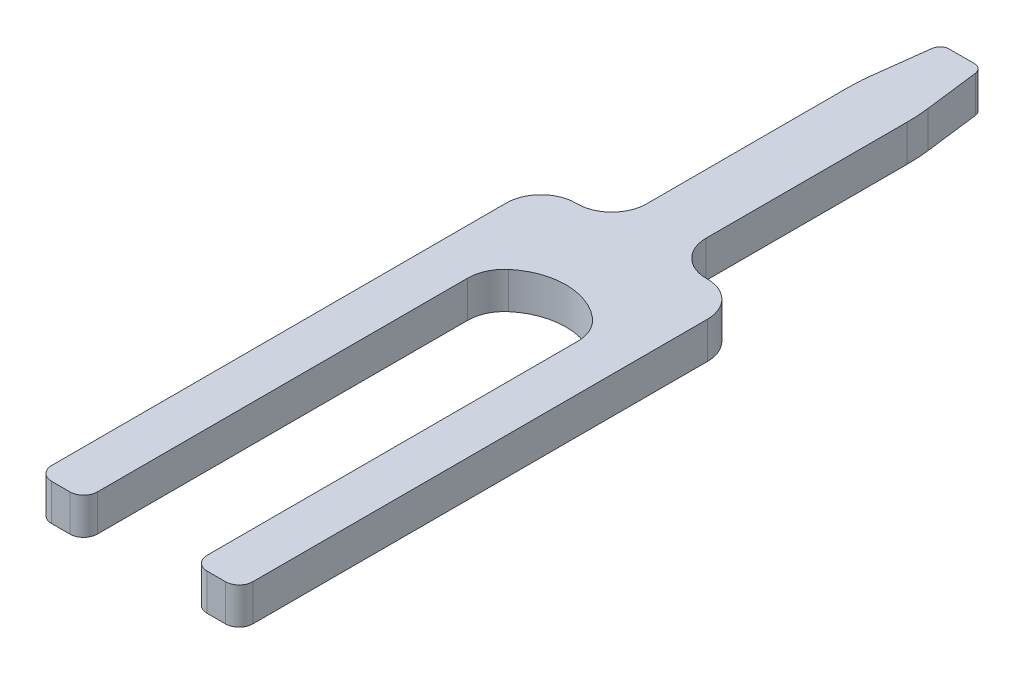
ISO-10303-21;
HEADER;
FILE_DESCRIPTION(('STEP AP214'),'2;1');
FILE_NAME('part.step','',(''),(''),'','','');
FILE_SCHEMA(('AUTOMOTIVE_DESIGN { 1 0 10303 214 1 1 1 1 }'));
ENDSEC;
DATA;
#1=APPLICATION_CONTEXT('core data for automotive mechanical design processes');
#2=APPLICATION_PROTOCOL_DEFINITION('international standard','automotive_design',2000,#1);
#3=PRODUCT_CONTEXT('',#1,'mechanical');
#4=PRODUCT('Part','Part','',(#3));
#5=PRODUCT_RELATED_PRODUCT_CATEGORY('part','',(#4));
#6=PRODUCT_DEFINITION_FORMATION('','',#4);
#7=PRODUCT_DEFINITION_CONTEXT('part definition',#1,'design');
#8=PRODUCT_DEFINITION('design','',#6,#7);
#9=PRODUCT_DEFINITION_SHAPE('','',#8);
#10=(LENGTH_UNIT() NAMED_UNIT(*) SI_UNIT(.MILLI.,.METRE.));
#11=(NAMED_UNIT(*) PLANE_ANGLE_UNIT() SI_UNIT($,.RADIAN.));
#12=(NAMED_UNIT(*) SI_UNIT($,.STERADIAN.) SOLID_ANGLE_UNIT());
#13=UNCERTAINTY_MEASURE_WITH_UNIT(LENGTH_MEASURE(1.E-05),#10,'distance_accuracy_value','');
#14=(GEOMETRIC_REPRESENTATION_CONTEXT(3) GLOBAL_UNCERTAINTY_ASSIGNED_CONTEXT((#13)) GLOBAL_UNIT_ASSIGNED_CONTEXT((#10,
#11,#12)) REPRESENTATION_CONTEXT('',''));
#15=CARTESIAN_POINT('',(0.,0.,0.));
#16=DIRECTION('',(0.,0.,1.));
#17=DIRECTION('',(1.,0.,0.));
#18=AXIS2_PLACEMENT_3D('',#15,#16,#17);
#19=CARTESIAN_POINT('',(0.720000000000001,-0.2,0.88));
#20=DIRECTION('',(0.,1.,0.));
#21=DIRECTION('',(0.,0.,1.));
#22=AXIS2_PLACEMENT_3D('',#19,#20,#21);
#23=CYLINDRICAL_SURFACE('',#22,0.38);
#24=DIRECTION('',(0.,1.,0.));
#25=VECTOR('',#24,1.);
#26=CARTESIAN_POINT('',(0.719999999999999,-0.2,0.5));
#27=LINE('',#26,#25);
#28=CARTESIAN_POINT('',(0.719999999999999,-0.2,0.5));
#29=VERTEX_POINT('',#28);
#30=CARTESIAN_POINT('',(0.719999999999999,0.2,0.5));
#31=VERTEX_POINT('',#30);
#32=EDGE_CURVE('E11',#29,#31,#27,.T.);
#33=ORIENTED_EDGE('',*,*,#32,.T.);
#34=CARTESIAN_POINT('',(0.720000000000001,0.2,0.88));
#35=DIRECTION('',(0.,1.,0.));
#36=DIRECTION('',(0.,0.,-1.));
#37=AXIS2_PLACEMENT_3D('',#34,#35,#36);
#38=CIRCLE('',#37,0.38);
#39=CARTESIAN_POINT('',(1.1,0.2,0.880000000000003));
#40=VERTEX_POINT('',#39);
#41=EDGE_CURVE('E24',#40,#31,#38,.T.);
#42=ORIENTED_EDGE('',*,*,#41,.F.);
#43=DIRECTION('',(0.,1.,0.));
#44=VECTOR('',#43,1.);
#45=CARTESIAN_POINT('',(1.1,-0.2,0.880000000000003));
#46=LINE('',#45,#44);
#47=CARTESIAN_POINT('',(1.1,-0.2,0.880000000000003));
#48=VERTEX_POINT('',#47);
#49=EDGE_CURVE('E443',#48,#40,#46,.T.);
#50=ORIENTED_EDGE('',*,*,#49,.F.);
#51=CARTESIAN_POINT('',(0.720000000000001,-0.2,0.88));
#52=DIRECTION('',(0.,1.,0.));
#53=DIRECTION('',(0.,0.,-1.));
#54=AXIS2_PLACEMENT_3D('',#51,#52,#53);
#55=CIRCLE('',#54,0.38);
#56=EDGE_CURVE('E441',#48,#29,#55,.T.);
#57=ORIENTED_EDGE('',*,*,#56,.T.);
#58=EDGE_LOOP('',(#33,#42,#50,#57));
#59=FACE_BOUND('',#58,.T.);
#60=ADVANCED_FACE('F17',(#59),#23,.T.);
#61=CARTESIAN_POINT('',(1.1,-0.2,0.880000000000003));
#62=DIRECTION('',(1.,0.,0.));
#63=DIRECTION('',(0.,0.,-1.));
#64=AXIS2_PLACEMENT_3D('',#61,#62,#63);
#65=PLANE('',#64);
#66=ORIENTED_EDGE('',*,*,#49,.T.);
#67=DIRECTION('',(0.,0.,-1.));
#68=VECTOR('',#67,1.);
#69=CARTESIAN_POINT('',(1.1,0.2,0.880000000000003));
#70=LINE('',#69,#68);
#71=CARTESIAN_POINT('',(1.1,0.2,5.85));
#72=VERTEX_POINT('',#71);
#73=EDGE_CURVE('E438',#72,#40,#70,.T.);
#74=ORIENTED_EDGE('',*,*,#73,.F.);
#75=DIRECTION('',(0.,1.,0.));
#76=VECTOR('',#75,1.);
#77=CARTESIAN_POINT('',(1.1,-0.2,5.85));
#78=LINE('',#77,#76);
#79=CARTESIAN_POINT('',(1.1,-0.2,5.85));
#80=VERTEX_POINT('',#79);
#81=EDGE_CURVE('E435',#80,#72,#78,.T.);
#82=ORIENTED_EDGE('',*,*,#81,.F.);
#83=DIRECTION('',(0.,0.,-1.));
#84=VECTOR('',#83,1.);
#85=CARTESIAN_POINT('',(1.1,-0.2,0.880000000000003));
#86=LINE('',#85,#84);
#87=EDGE_CURVE('E432',#80,#48,#86,.T.);
#88=ORIENTED_EDGE('',*,*,#87,.T.);
#89=EDGE_LOOP('',(#66,#74,#82,#88));
#90=FACE_BOUND('',#89,.T.);
#91=ADVANCED_FACE('F448',(#90),#65,.T.);
#92=CARTESIAN_POINT('',(0.950000000000002,-0.2,5.85));
#93=DIRECTION('',(0.,1.,0.));
#94=DIRECTION('',(0.,0.,1.));
#95=AXIS2_PLACEMENT_3D('',#92,#93,#94);
#96=CYLINDRICAL_SURFACE('',#95,0.15);
#97=ORIENTED_EDGE('',*,*,#81,.T.);
#98=CARTESIAN_POINT('',(0.950000000000002,0.2,5.85));
#99=DIRECTION('',(0.,1.,0.));
#100=DIRECTION('',(0.,0.,1.));
#101=AXIS2_PLACEMENT_3D('',#98,#99,#100);
#102=CIRCLE('',#101,0.15);
#103=CARTESIAN_POINT('',(0.950000000000002,0.2,6.));
#104=VERTEX_POINT('',#103);
#105=EDGE_CURVE('E429',#104,#72,#102,.T.);
#106=ORIENTED_EDGE('',*,*,#105,.F.);
#107=DIRECTION('',(0.,1.,0.));
#108=VECTOR('',#107,1.);
#109=CARTESIAN_POINT('',(0.950000000000002,-0.2,6.));
#110=LINE('',#109,#108);
#111=CARTESIAN_POINT('',(0.950000000000002,-0.2,6.));
#112=VERTEX_POINT('',#111);
#113=EDGE_CURVE('E426',#112,#104,#110,.T.);
#114=ORIENTED_EDGE('',*,*,#113,.F.);
#115=CARTESIAN_POINT('',(0.950000000000002,-0.2,5.85));
#116=DIRECTION('',(0.,1.,0.));
#117=DIRECTION('',(0.,0.,1.));
#118=AXIS2_PLACEMENT_3D('',#115,#116,#117);
#119=CIRCLE('',#118,0.15);
#120=EDGE_CURVE('E423',#112,#80,#119,.T.);
#121=ORIENTED_EDGE('',*,*,#120,.T.);
#122=EDGE_LOOP('',(#97,#106,#114,#121));
#123=FACE_BOUND('',#122,.T.);
#124=ADVANCED_FACE('F453',(#123),#96,.T.);
#125=CARTESIAN_POINT('',(0.750000000000002,-0.2,6.));
#126=DIRECTION('',(0.,0.,1.));
#127=DIRECTION('',(1.,0.,0.));
#128=AXIS2_PLACEMENT_3D('',#125,#126,#127);
#129=PLANE('',#128);
#130=ORIENTED_EDGE('',*,*,#113,.T.);
#131=DIRECTION('',(1.,0.,0.));
#132=VECTOR('',#131,1.);
#133=CARTESIAN_POINT('',(0.750000000000002,0.2,6.));
#134=LINE('',#133,#132);
#135=CARTESIAN_POINT('',(0.750000000000002,0.2,6.));
#136=VERTEX_POINT('',#135);
#137=EDGE_CURVE('E420',#136,#104,#134,.T.);
#138=ORIENTED_EDGE('',*,*,#137,.F.);
#139=DIRECTION('',(0.,1.,0.));
#140=VECTOR('',#139,1.);
#141=CARTESIAN_POINT('',(0.750000000000002,-0.2,6.));
#142=LINE('',#141,#140);
#143=CARTESIAN_POINT('',(0.750000000000002,-0.2,6.));
#144=VERTEX_POINT('',#143);
#145=EDGE_CURVE('E417',#144,#136,#142,.T.);
#146=ORIENTED_EDGE('',*,*,#145,.F.);
#147=DIRECTION('',(1.,0.,0.));
#148=VECTOR('',#147,1.);
#149=CARTESIAN_POINT('',(0.750000000000002,-0.2,6.));
#150=LINE('',#149,#148);
#151=EDGE_CURVE('E414',#144,#112,#150,.T.);
#152=ORIENTED_EDGE('',*,*,#151,.T.);
#153=EDGE_LOOP('',(#130,#138,#146,#152));
#154=FACE_BOUND('',#153,.T.);
#155=ADVANCED_FACE('F455',(#154),#129,.T.);
#156=CARTESIAN_POINT('',(0.750000000000002,-0.2,5.85));
#157=DIRECTION('',(0.,1.,0.));
#158=DIRECTION('',(0.,0.,1.));
#159=AXIS2_PLACEMENT_3D('',#156,#157,#158);
#160=CYLINDRICAL_SURFACE('',#159,0.15);
#161=ORIENTED_EDGE('',*,*,#145,.T.);
#162=CARTESIAN_POINT('',(0.750000000000002,0.2,5.85));
#163=DIRECTION('',(0.,1.,0.));
#164=DIRECTION('',(0.,0.,1.));
#165=AXIS2_PLACEMENT_3D('',#162,#163,#164);
#166=CIRCLE('',#165,0.15);
#167=CARTESIAN_POINT('',(0.600000000000002,0.2,5.85));
#168=VERTEX_POINT('',#167);
#169=EDGE_CURVE('E411',#168,#136,#166,.T.);
#170=ORIENTED_EDGE('',*,*,#169,.F.);
#171=DIRECTION('',(0.,1.,0.));
#172=VECTOR('',#171,1.);
#173=CARTESIAN_POINT('',(0.600000000000002,-0.2,5.85));
#174=LINE('',#173,#172);
#175=CARTESIAN_POINT('',(0.600000000000002,-0.2,5.85));
#176=VERTEX_POINT('',#175);
#177=EDGE_CURVE('E408',#176,#168,#174,.T.);
#178=ORIENTED_EDGE('',*,*,#177,.F.);
#179=CARTESIAN_POINT('',(0.750000000000002,-0.2,5.85));
#180=DIRECTION('',(0.,1.,0.));
#181=DIRECTION('',(0.,0.,1.));
#182=AXIS2_PLACEMENT_3D('',#179,#180,#181);
#183=CIRCLE('',#182,0.15);
#184=EDGE_CURVE('E405',#176,#144,#183,.T.);
#185=ORIENTED_EDGE('',*,*,#184,.T.);
#186=EDGE_LOOP('',(#161,#170,#178,#185));
#187=FACE_BOUND('',#186,.T.);
#188=ADVANCED_FACE('F457',(#187),#160,.T.);
#189=CARTESIAN_POINT('',(0.600000000000001,-0.2,1.8007390104135));
#190=DIRECTION('',(-1.,0.,0.));
#191=DIRECTION('',(0.,0.,1.));
#192=AXIS2_PLACEMENT_3D('',#189,#190,#191);
#193=PLANE('',#192);
#194=ORIENTED_EDGE('',*,*,#177,.T.);
#195=DIRECTION('',(0.,0.,1.));
#196=VECTOR('',#195,1.);
#197=CARTESIAN_POINT('',(0.600000000000001,0.2,1.8007390104135));
#198=LINE('',#197,#196);
#199=CARTESIAN_POINT('',(0.600000000000001,0.2,1.8007390104135));
#200=VERTEX_POINT('',#199);
#201=EDGE_CURVE('E402',#200,#168,#198,.T.);
#202=ORIENTED_EDGE('',*,*,#201,.F.);
#203=DIRECTION('',(0.,1.,0.));
#204=VECTOR('',#203,1.);
#205=CARTESIAN_POINT('',(0.600000000000001,-0.2,1.8007390104135));
#206=LINE('',#205,#204);
#207=CARTESIAN_POINT('',(0.600000000000001,-0.2,1.8007390104135));
#208=VERTEX_POINT('',#207);
#209=EDGE_CURVE('E399',#208,#200,#206,.T.);
#210=ORIENTED_EDGE('',*,*,#209,.F.);
#211=DIRECTION('',(0.,0.,1.));
#212=VECTOR('',#211,1.);
#213=CARTESIAN_POINT('',(0.600000000000001,-0.2,1.8007390104135));
#214=LINE('',#213,#212);
#215=EDGE_CURVE('E396',#208,#176,#214,.T.);
#216=ORIENTED_EDGE('',*,*,#215,.T.);
#217=EDGE_LOOP('',(#194,#202,#210,#216));
#218=FACE_BOUND('',#217,.T.);
#219=ADVANCED_FACE('F460',(#218),#193,.T.);
#220=CARTESIAN_POINT('',(0.200000000000001,-0.2,1.8007390104135));
#221=DIRECTION('',(0.,1.,0.));
#222=DIRECTION('',(0.,0.,1.));
#223=AXIS2_PLACEMENT_3D('',#220,#221,#222);
#224=CYLINDRICAL_SURFACE('',#223,0.4);
#225=ORIENTED_EDGE('',*,*,#209,.T.);
#226=CARTESIAN_POINT('',(0.200000000000001,0.2,1.8007390104135));
#227=DIRECTION('',(0.,-1.,0.));
#228=DIRECTION('',(0.,0.,-1.));
#229=AXIS2_PLACEMENT_3D('',#226,#227,#228);
#230=CIRCLE('',#229,0.4);
#231=CARTESIAN_POINT('',(0.459500566420053,0.2,1.49633885268083));
#232=VERTEX_POINT('',#231);
#233=EDGE_CURVE('E393',#232,#200,#230,.T.);
#234=ORIENTED_EDGE('',*,*,#233,.F.);
#235=DIRECTION('',(0.,1.,0.));
#236=VECTOR('',#235,1.);
#237=CARTESIAN_POINT('',(0.459500566420053,-0.2,1.49633885268083));
#238=LINE('',#237,#236);
#239=CARTESIAN_POINT('',(0.459500566420053,-0.2,1.49633885268083));
#240=VERTEX_POINT('',#239);
#241=EDGE_CURVE('E391',#240,#232,#238,.T.);
#242=ORIENTED_EDGE('',*,*,#241,.F.);
#243=CARTESIAN_POINT('',(0.200000000000001,-0.2,1.8007390104135));
#244=DIRECTION('',(0.,-1.,0.));
#245=DIRECTION('',(0.,0.,-1.));
#246=AXIS2_PLACEMENT_3D('',#243,#244,#245);
#247=CIRCLE('',#246,0.4);
#248=EDGE_CURVE('E388',#240,#208,#247,.T.);
#249=ORIENTED_EDGE('',*,*,#248,.T.);
#250=EDGE_LOOP('',(#225,#234,#242,#249));
#251=FACE_BOUND('',#250,.T.);
#252=ADVANCED_FACE('F464',(#251),#224,.F.);
#253=CARTESIAN_POINT('',(0.,-0.2,2.03534362953401));
#254=DIRECTION('',(0.,1.,0.));
#255=DIRECTION('',(0.,0.,1.));
#256=AXIS2_PLACEMENT_3D('',#253,#254,#255);
#257=CYLINDRICAL_SURFACE('',#256,0.708284490872768);
#258=ORIENTED_EDGE('',*,*,#241,.T.);
#259=CARTESIAN_POINT('',(0.,0.2,2.03534362953401));
#260=DIRECTION('',(0.,-1.,0.));
#261=DIRECTION('',(0.,0.,-1.));
#262=AXIS2_PLACEMENT_3D('',#259,#260,#261);
#263=CIRCLE('',#262,0.708284490872768);
#264=CARTESIAN_POINT('',(-0.459500566420046,0.2,1.49633885268083));
#265=VERTEX_POINT('',#264);
#266=EDGE_CURVE('E385',#265,#232,#263,.T.);
#267=ORIENTED_EDGE('',*,*,#266,.F.);
#268=DIRECTION('',(0.,1.,0.));
#269=VECTOR('',#268,1.);
#270=CARTESIAN_POINT('',(-0.459500566420046,-0.2,1.49633885268083));
#271=LINE('',#270,#269);
#272=CARTESIAN_POINT('',(-0.459500566420046,-0.2,1.49633885268083));
#273=VERTEX_POINT('',#272);
#274=EDGE_CURVE('E383',#273,#265,#271,.T.);
#275=ORIENTED_EDGE('',*,*,#274,.F.);
#276=CARTESIAN_POINT('',(0.,-0.2,2.03534362953401));
#277=DIRECTION('',(0.,-1.,0.));
#278=DIRECTION('',(0.,0.,-1.));
#279=AXIS2_PLACEMENT_3D('',#276,#277,#278);
#280=CIRCLE('',#279,0.708284490872768);
#281=EDGE_CURVE('E380',#273,#240,#280,.T.);
#282=ORIENTED_EDGE('',*,*,#281,.T.);
#283=EDGE_LOOP('',(#258,#267,#275,#282));
#284=FACE_BOUND('',#283,.T.);
#285=ADVANCED_FACE('F469',(#284),#257,.F.);
#286=CARTESIAN_POINT('',(-0.199999999999998,-0.2,1.8007390104135));
#287=DIRECTION('',(0.,1.,0.));
#288=DIRECTION('',(0.,0.,1.));
#289=AXIS2_PLACEMENT_3D('',#286,#287,#288);
#290=CYLINDRICAL_SURFACE('',#289,0.4);
#291=ORIENTED_EDGE('',*,*,#274,.T.);
#292=CARTESIAN_POINT('',(-0.199999999999998,0.2,1.8007390104135));
#293=DIRECTION('',(0.,-1.,0.));
#294=DIRECTION('',(0.,0.,-1.));
#295=AXIS2_PLACEMENT_3D('',#292,#293,#294);
#296=CIRCLE('',#295,0.4);
#297=CARTESIAN_POINT('',(-0.599999999999998,0.2,1.8007390104135));
#298=VERTEX_POINT('',#297);
#299=EDGE_CURVE('E377',#298,#265,#296,.T.);
#300=ORIENTED_EDGE('',*,*,#299,.F.);
#301=DIRECTION('',(0.,1.,0.));
#302=VECTOR('',#301,1.);
#303=CARTESIAN_POINT('',(-0.599999999999998,-0.2,1.8007390104135));
#304=LINE('',#303,#302);
#305=CARTESIAN_POINT('',(-0.599999999999998,-0.2,1.8007390104135));
#306=VERTEX_POINT('',#305);
#307=EDGE_CURVE('E375',#306,#298,#304,.T.);
#308=ORIENTED_EDGE('',*,*,#307,.F.);
#309=CARTESIAN_POINT('',(-0.199999999999998,-0.2,1.8007390104135));
#310=DIRECTION('',(0.,-1.,0.));
#311=DIRECTION('',(0.,0.,-1.));
#312=AXIS2_PLACEMENT_3D('',#309,#310,#311);
#313=CIRCLE('',#312,0.4);
#314=EDGE_CURVE('E372',#306,#273,#313,.T.);
#315=ORIENTED_EDGE('',*,*,#314,.T.);
#316=EDGE_LOOP('',(#291,#300,#308,#315));
#317=FACE_BOUND('',#316,.T.);
#318=ADVANCED_FACE('F475',(#317),#290,.F.);
#319=CARTESIAN_POINT('',(-0.599999999999998,-0.2,5.85));
#320=DIRECTION('',(1.,0.,0.));
#321=DIRECTION('',(0.,0.,-1.));
#322=AXIS2_PLACEMENT_3D('',#319,#320,#321);
#323=PLANE('',#322);
#324=ORIENTED_EDGE('',*,*,#307,.T.);
#325=DIRECTION('',(0.,0.,-1.));
#326=VECTOR('',#325,1.);
#327=CARTESIAN_POINT('',(-0.599999999999998,0.2,5.85));
#328=LINE('',#327,#326);
#329=CARTESIAN_POINT('',(-0.599999999999998,0.2,5.85));
#330=VERTEX_POINT('',#329);
#331=EDGE_CURVE('E369',#330,#298,#328,.T.);
#332=ORIENTED_EDGE('',*,*,#331,.F.);
#333=DIRECTION('',(0.,1.,0.));
#334=VECTOR('',#333,1.);
#335=CARTESIAN_POINT('',(-0.599999999999998,-0.2,5.85));
#336=LINE('',#335,#334);
#337=CARTESIAN_POINT('',(-0.599999999999998,-0.2,5.85));
#338=VERTEX_POINT('',#337);
#339=EDGE_CURVE('E366',#338,#330,#336,.T.);
#340=ORIENTED_EDGE('',*,*,#339,.F.);
#341=DIRECTION('',(0.,0.,-1.));
#342=VECTOR('',#341,1.);
#343=CARTESIAN_POINT('',(-0.599999999999998,-0.2,5.85));
#344=LINE('',#343,#342);
#345=EDGE_CURVE('E363',#338,#306,#344,.T.);
#346=ORIENTED_EDGE('',*,*,#345,.T.);
#347=EDGE_LOOP('',(#324,#332,#340,#346));
#348=FACE_BOUND('',#347,.T.);
#349=ADVANCED_FACE('F477',(#348),#323,.T.);
#350=CARTESIAN_POINT('',(-0.749999999999998,-0.2,5.85));
#351=DIRECTION('',(0.,1.,0.));
#352=DIRECTION('',(0.,0.,1.));
#353=AXIS2_PLACEMENT_3D('',#350,#351,#352);
#354=CYLINDRICAL_SURFACE('',#353,0.15);
#355=ORIENTED_EDGE('',*,*,#339,.T.);
#356=CARTESIAN_POINT('',(-0.749999999999998,0.2,5.85));
#357=DIRECTION('',(0.,1.,0.));
#358=DIRECTION('',(0.,0.,-1.));
#359=AXIS2_PLACEMENT_3D('',#356,#357,#358);
#360=CIRCLE('',#359,0.15);
#361=CARTESIAN_POINT('',(-0.749999999999998,0.2,6.));
#362=VERTEX_POINT('',#361);
#363=EDGE_CURVE('E360',#362,#330,#360,.T.);
#364=ORIENTED_EDGE('',*,*,#363,.F.);
#365=DIRECTION('',(0.,1.,0.));
#366=VECTOR('',#365,1.);
#367=CARTESIAN_POINT('',(-0.749999999999998,-0.2,6.));
#368=LINE('',#367,#366);
#369=CARTESIAN_POINT('',(-0.749999999999998,-0.2,6.));
#370=VERTEX_POINT('',#369);
#371=EDGE_CURVE('E357',#370,#362,#368,.T.);
#372=ORIENTED_EDGE('',*,*,#371,.F.);
#373=CARTESIAN_POINT('',(-0.749999999999998,-0.2,5.85));
#374=DIRECTION('',(0.,1.,0.));
#375=DIRECTION('',(0.,0.,-1.));
#376=AXIS2_PLACEMENT_3D('',#373,#374,#375);
#377=CIRCLE('',#376,0.15);
#378=EDGE_CURVE('E354',#370,#338,#377,.T.);
#379=ORIENTED_EDGE('',*,*,#378,.T.);
#380=EDGE_LOOP('',(#355,#364,#372,#379));
#381=FACE_BOUND('',#380,.T.);
#382=ADVANCED_FACE('F479',(#381),#354,.T.);
#383=CARTESIAN_POINT('',(-0.949999999999998,-0.2,6.));
#384=DIRECTION('',(0.,0.,1.));
#385=DIRECTION('',(1.,0.,0.));
#386=AXIS2_PLACEMENT_3D('',#383,#384,#385);
#387=PLANE('',#386);
#388=ORIENTED_EDGE('',*,*,#371,.T.);
#389=DIRECTION('',(1.,0.,0.));
#390=VECTOR('',#389,1.);
#391=CARTESIAN_POINT('',(-0.949999999999998,0.2,6.));
#392=LINE('',#391,#390);
#393=CARTESIAN_POINT('',(-0.949999999999998,0.2,6.));
#394=VERTEX_POINT('',#393);
#395=EDGE_CURVE('E351',#394,#362,#392,.T.);
#396=ORIENTED_EDGE('',*,*,#395,.F.);
#397=DIRECTION('',(0.,1.,0.));
#398=VECTOR('',#397,1.);
#399=CARTESIAN_POINT('',(-0.949999999999998,-0.2,6.));
#400=LINE('',#399,#398);
#401=CARTESIAN_POINT('',(-0.949999999999998,-0.2,6.));
#402=VERTEX_POINT('',#401);
#403=EDGE_CURVE('E348',#402,#394,#400,.T.);
#404=ORIENTED_EDGE('',*,*,#403,.F.);
#405=DIRECTION('',(1.,0.,0.));
#406=VECTOR('',#405,1.);
#407=CARTESIAN_POINT('',(-0.949999999999998,-0.2,6.));
#408=LINE('',#407,#406);
#409=EDGE_CURVE('E345',#402,#370,#408,.T.);
#410=ORIENTED_EDGE('',*,*,#409,.T.);
#411=EDGE_LOOP('',(#388,#396,#404,#410));
#412=FACE_BOUND('',#411,.T.);
#413=ADVANCED_FACE('F481',(#412),#387,.T.);
#414=CARTESIAN_POINT('',(-0.949999999999998,-0.2,5.85));
#415=DIRECTION('',(0.,1.,0.));
#416=DIRECTION('',(0.,0.,1.));
#417=AXIS2_PLACEMENT_3D('',#414,#415,#416);
#418=CYLINDRICAL_SURFACE('',#417,0.15);
#419=ORIENTED_EDGE('',*,*,#403,.T.);
#420=CARTESIAN_POINT('',(-0.949999999999998,0.2,5.85));
#421=DIRECTION('',(0.,1.,0.));
#422=DIRECTION('',(0.,0.,1.));
#423=AXIS2_PLACEMENT_3D('',#420,#421,#422);
#424=CIRCLE('',#423,0.15);
#425=CARTESIAN_POINT('',(-1.1,0.2,5.85));
#426=VERTEX_POINT('',#425);
#427=EDGE_CURVE('E342',#426,#394,#424,.T.);
#428=ORIENTED_EDGE('',*,*,#427,.F.);
#429=DIRECTION('',(0.,1.,0.));
#430=VECTOR('',#429,1.);
#431=CARTESIAN_POINT('',(-1.1,-0.2,5.85));
#432=LINE('',#431,#430);
#433=CARTESIAN_POINT('',(-1.1,-0.2,5.85));
#434=VERTEX_POINT('',#433);
#435=EDGE_CURVE('E339',#434,#426,#432,.T.);
#436=ORIENTED_EDGE('',*,*,#435,.F.);
#437=CARTESIAN_POINT('',(-0.949999999999998,-0.2,5.85));
#438=DIRECTION('',(0.,1.,0.));
#439=DIRECTION('',(0.,0.,1.));
#440=AXIS2_PLACEMENT_3D('',#437,#438,#439);
#441=CIRCLE('',#440,0.15);
#442=EDGE_CURVE('E336',#434,#402,#441,.T.);
#443=ORIENTED_EDGE('',*,*,#442,.T.);
#444=EDGE_LOOP('',(#419,#428,#436,#443));
#445=FACE_BOUND('',#444,.T.);
#446=ADVANCED_FACE('F484',(#445),#418,.T.);
#447=CARTESIAN_POINT('',(-1.1,-0.2,0.880000000000003));
#448=DIRECTION('',(-1.,0.,0.));
#449=DIRECTION('',(0.,0.,1.));
#450=AXIS2_PLACEMENT_3D('',#447,#448,#449);
#451=PLANE('',#450);
#452=ORIENTED_EDGE('',*,*,#435,.T.);
#453=DIRECTION('',(0.,0.,1.));
#454=VECTOR('',#453,1.);
#455=CARTESIAN_POINT('',(-1.1,0.2,0.880000000000003));
#456=LINE('',#455,#454);
#457=CARTESIAN_POINT('',(-1.1,0.2,0.880000000000003));
#458=VERTEX_POINT('',#457);
#459=EDGE_CURVE('E333',#458,#426,#456,.T.);
#460=ORIENTED_EDGE('',*,*,#459,.F.);
#461=DIRECTION('',(0.,1.,0.));
#462=VECTOR('',#461,1.);
#463=CARTESIAN_POINT('',(-1.1,-0.2,0.880000000000003));
#464=LINE('',#463,#462);
#465=CARTESIAN_POINT('',(-1.1,-0.2,0.880000000000003));
#466=VERTEX_POINT('',#465);
#467=EDGE_CURVE('E330',#466,#458,#464,.T.);
#468=ORIENTED_EDGE('',*,*,#467,.F.);
#469=DIRECTION('',(0.,0.,1.));
#470=VECTOR('',#469,1.);
#471=CARTESIAN_POINT('',(-1.1,-0.2,0.880000000000003));
#472=LINE('',#471,#470);
#473=EDGE_CURVE('E327',#466,#434,#472,.T.);
#474=ORIENTED_EDGE('',*,*,#473,.T.);
#475=EDGE_LOOP('',(#452,#460,#468,#474));
#476=FACE_BOUND('',#475,.T.);
#477=ADVANCED_FACE('F489',(#476),#451,.T.);
#478=CARTESIAN_POINT('',(-0.719999999999999,-0.2,0.88));
#479=DIRECTION('',(0.,1.,0.));
#480=DIRECTION('',(0.,0.,1.));
#481=AXIS2_PLACEMENT_3D('',#478,#479,#480);
#482=CYLINDRICAL_SURFACE('',#481,0.38);
#483=ORIENTED_EDGE('',*,*,#467,.T.);
#484=CARTESIAN_POINT('',(-0.719999999999999,0.2,0.88));
#485=DIRECTION('',(0.,1.,0.));
#486=DIRECTION('',(0.,0.,1.));
#487=AXIS2_PLACEMENT_3D('',#484,#485,#486);
#488=CIRCLE('',#487,0.38);
#489=CARTESIAN_POINT('',(-0.719999999999996,0.2,0.5));
#490=VERTEX_POINT('',#489);
#491=EDGE_CURVE('E324',#490,#458,#488,.T.);
#492=ORIENTED_EDGE('',*,*,#491,.F.);
#493=DIRECTION('',(0.,1.,0.));
#494=VECTOR('',#493,1.);
#495=CARTESIAN_POINT('',(-0.719999999999996,-0.2,0.5));
#496=LINE('',#495,#494);
#497=CARTESIAN_POINT('',(-0.719999999999996,-0.2,0.5));
#498=VERTEX_POINT('',#497);
#499=EDGE_CURVE('E321',#498,#490,#496,.T.);
#500=ORIENTED_EDGE('',*,*,#499,.F.);
#501=CARTESIAN_POINT('',(-0.719999999999999,-0.2,0.88));
#502=DIRECTION('',(0.,1.,0.));
#503=DIRECTION('',(0.,0.,1.));
#504=AXIS2_PLACEMENT_3D('',#501,#502,#503);
#505=CIRCLE('',#504,0.38);
#506=EDGE_CURVE('E318',#498,#466,#505,.T.);
#507=ORIENTED_EDGE('',*,*,#506,.T.);
#508=EDGE_LOOP('',(#483,#492,#500,#507));
#509=FACE_BOUND('',#508,.T.);
#510=ADVANCED_FACE('F491',(#509),#482,.T.);
#511=CARTESIAN_POINT('',(-0.719999999999996,-0.2,0.5));
#512=DIRECTION('',(0.,0.,-1.));
#513=DIRECTION('',(-1.,0.,0.));
#514=AXIS2_PLACEMENT_3D('',#511,#512,#513);
#515=PLANE('',#514);
#516=ORIENTED_EDGE('',*,*,#499,.T.);
#517=DIRECTION('',(-1.,0.,0.));
#518=VECTOR('',#517,1.);
#519=CARTESIAN_POINT('',(-0.719999999999996,0.2,0.5));
#520=LINE('',#519,#518);
#521=CARTESIAN_POINT('',(-0.705000000000004,0.2,0.5));
#522=VERTEX_POINT('',#521);
#523=EDGE_CURVE('E315',#522,#490,#520,.T.);
#524=ORIENTED_EDGE('',*,*,#523,.F.);
#525=DIRECTION('',(0.,1.,0.));
#526=VECTOR('',#525,1.);
#527=CARTESIAN_POINT('',(-0.705000000000004,-0.2,0.5));
#528=LINE('',#527,#526);
#529=CARTESIAN_POINT('',(-0.705000000000004,-0.2,0.5));
#530=VERTEX_POINT('',#529);
#531=EDGE_CURVE('E312',#530,#522,#528,.T.);
#532=ORIENTED_EDGE('',*,*,#531,.F.);
#533=DIRECTION('',(-1.,0.,0.));
#534=VECTOR('',#533,1.);
#535=CARTESIAN_POINT('',(-0.719999999999996,-0.2,0.5));
#536=LINE('',#535,#534);
#537=EDGE_CURVE('E309',#530,#498,#536,.T.);
#538=ORIENTED_EDGE('',*,*,#537,.T.);
#539=EDGE_LOOP('',(#516,#524,#532,#538));
#540=FACE_BOUND('',#539,.T.);
#541=ADVANCED_FACE('F494',(#540),#515,.T.);
#542=CARTESIAN_POINT('',(-0.705000000000002,-0.2,0.12));
#543=DIRECTION('',(0.,1.,0.));
#544=DIRECTION('',(0.,0.,1.));
#545=AXIS2_PLACEMENT_3D('',#542,#543,#544);
#546=CYLINDRICAL_SURFACE('',#545,0.38);
#547=ORIENTED_EDGE('',*,*,#531,.T.);
#548=CARTESIAN_POINT('',(-0.705000000000002,0.2,0.12));
#549=DIRECTION('',(0.,-1.,0.));
#550=DIRECTION('',(0.,0.,1.));
#551=AXIS2_PLACEMENT_3D('',#548,#549,#550);
#552=CIRCLE('',#551,0.38);
#553=CARTESIAN_POINT('',(-0.325000000000002,0.2,0.119999999999997));
#554=VERTEX_POINT('',#553);
#555=EDGE_CURVE('E306',#554,#522,#552,.T.);
#556=ORIENTED_EDGE('',*,*,#555,.F.);
#557=DIRECTION('',(0.,1.,0.));
#558=VECTOR('',#557,1.);
#559=CARTESIAN_POINT('',(-0.325000000000002,-0.2,0.119999999999997));
#560=LINE('',#559,#558);
#561=CARTESIAN_POINT('',(-0.325000000000002,-0.2,0.119999999999997));
#562=VERTEX_POINT('',#561);
#563=EDGE_CURVE('E304',#562,#554,#560,.T.);
#564=ORIENTED_EDGE('',*,*,#563,.F.);
#565=CARTESIAN_POINT('',(-0.705000000000002,-0.2,0.12));
#566=DIRECTION('',(0.,-1.,0.));
#567=DIRECTION('',(0.,0.,1.));
#568=AXIS2_PLACEMENT_3D('',#565,#566,#567);
#569=CIRCLE('',#568,0.38);
#570=EDGE_CURVE('E301',#562,#530,#569,.T.);
#571=ORIENTED_EDGE('',*,*,#570,.T.);
#572=EDGE_LOOP('',(#547,#556,#564,#571));
#573=FACE_BOUND('',#572,.T.);
#574=ADVANCED_FACE('F497',(#573),#546,.F.);
#575=CARTESIAN_POINT('',(-0.325000000000002,-0.2,0.119999999999997));
#576=DIRECTION('',(-1.,0.,0.));
#577=DIRECTION('',(0.,0.,1.));
#578=AXIS2_PLACEMENT_3D('',#575,#576,#577);
#579=PLANE('',#578);
#580=ORIENTED_EDGE('',*,*,#563,.T.);
#581=DIRECTION('',(0.,0.,1.));
#582=VECTOR('',#581,1.);
#583=CARTESIAN_POINT('',(-0.325000000000002,0.2,0.119999999999997));
#584=LINE('',#583,#582);
#585=CARTESIAN_POINT('',(-0.325,0.2,-2.07548450340289));
#586=VERTEX_POINT('',#585);
#587=EDGE_CURVE('E298',#586,#554,#584,.T.);
#588=ORIENTED_EDGE('',*,*,#587,.F.);
#589=DIRECTION('',(0.,1.,0.));
#590=VECTOR('',#589,1.);
#591=CARTESIAN_POINT('',(-0.325,-0.2,-2.07548450340289));
#592=LINE('',#591,#590);
#593=CARTESIAN_POINT('',(-0.325,-0.2,-2.07548450340289));
#594=VERTEX_POINT('',#593);
#595=EDGE_CURVE('E295',#594,#586,#592,.T.);
#596=ORIENTED_EDGE('',*,*,#595,.F.);
#597=DIRECTION('',(0.,0.,1.));
#598=VECTOR('',#597,1.);
#599=CARTESIAN_POINT('',(-0.325000000000002,-0.2,0.119999999999997));
#600=LINE('',#599,#598);
#601=EDGE_CURVE('E292',#594,#562,#600,.T.);
#602=ORIENTED_EDGE('',*,*,#601,.T.);
#603=EDGE_LOOP('',(#580,#588,#596,#602));
#604=FACE_BOUND('',#603,.T.);
#605=ADVANCED_FACE('F569',(#604),#579,.T.);
#606=CARTESIAN_POINT('',(1.675,-0.2,-2.0754845034029));
#607=DIRECTION('',(0.,1.,0.));
#608=DIRECTION('',(0.,0.,1.));
#609=AXIS2_PLACEMENT_3D('',#606,#607,#608);
#610=CYLINDRICAL_SURFACE('',#609,2.);
#611=ORIENTED_EDGE('',*,*,#595,.T.);
#612=CARTESIAN_POINT('',(1.675,0.2,-2.0754845034029));
#613=DIRECTION('',(0.,1.,0.));
#614=DIRECTION('',(0.,0.,1.));
#615=AXIS2_PLACEMENT_3D('',#612,#613,#614);
#616=CIRCLE('',#615,2.);
#617=CARTESIAN_POINT('',(-0.309555753427334,0.2,-2.32355397258132));
#618=VERTEX_POINT('',#617);
#619=EDGE_CURVE('E289',#618,#586,#616,.T.);
#620=ORIENTED_EDGE('',*,*,#619,.F.);
#621=DIRECTION('',(0.,1.,0.));
#622=VECTOR('',#621,1.);
#623=CARTESIAN_POINT('',(-0.309555753427334,-0.2,-2.32355397258132));
#624=LINE('',#623,#622);
#625=CARTESIAN_POINT('',(-0.309555753427334,-0.2,-2.32355397258132));
#626=VERTEX_POINT('',#625);
#627=EDGE_CURVE('E286',#626,#618,#624,.T.);
#628=ORIENTED_EDGE('',*,*,#627,.F.);
#629=CARTESIAN_POINT('',(1.675,-0.2,-2.0754845034029));
#630=DIRECTION('',(0.,1.,0.));
#631=DIRECTION('',(0.,0.,1.));
#632=AXIS2_PLACEMENT_3D('',#629,#630,#631);
#633=CIRCLE('',#632,2.);
#634=EDGE_CURVE('E283',#626,#594,#633,.T.);
#635=ORIENTED_EDGE('',*,*,#634,.T.);
#636=EDGE_LOOP('',(#611,#620,#628,#635));
#637=FACE_BOUND('',#636,.T.);
#638=ADVANCED_FACE('F504',(#637),#610,.T.);
#639=CARTESIAN_POINT('',(-0.309555753427334,-0.2,-2.32355397258132));
#640=DIRECTION('',(-0.992277876713668,0.,-0.124034734589208));
#641=DIRECTION('',(-0.124034734589208,0.,0.992277876713668));
#642=AXIS2_PLACEMENT_3D('',#639,#640,#641);
#643=PLANE('',#642);
#644=ORIENTED_EDGE('',*,*,#627,.T.);
#645=DIRECTION('',(-0.124034734589208,0.,0.992277876713668));
#646=VECTOR('',#645,1.);
#647=CARTESIAN_POINT('',(-0.309555753427334,0.2,-2.32355397258132));
#648=LINE('',#647,#646);
#649=CARTESIAN_POINT('',(-0.235949565817635,0.2,-2.91240347345892));
#650=VERTEX_POINT('',#649);
#651=EDGE_CURVE('E280',#650,#618,#648,.T.);
#652=ORIENTED_EDGE('',*,*,#651,.F.);
#653=DIRECTION('',(0.,1.,0.));
#654=VECTOR('',#653,1.);
#655=CARTESIAN_POINT('',(-0.235949565817635,-0.2,-2.91240347345892));
#656=LINE('',#655,#654);
#657=CARTESIAN_POINT('',(-0.235949565817635,-0.2,-2.91240347345892));
#658=VERTEX_POINT('',#657);
#659=EDGE_CURVE('E277',#658,#650,#656,.T.);
#660=ORIENTED_EDGE('',*,*,#659,.F.);
#661=DIRECTION('',(-0.124034734589208,0.,0.992277876713668));
#662=VECTOR('',#661,1.);
#663=CARTESIAN_POINT('',(-0.309555753427334,-0.2,-2.32355397258132));
#664=LINE('',#663,#662);
#665=EDGE_CURVE('E274',#658,#626,#664,.T.);
#666=ORIENTED_EDGE('',*,*,#665,.T.);
#667=EDGE_LOOP('',(#644,#652,#660,#666));
#668=FACE_BOUND('',#667,.T.);
#669=ADVANCED_FACE('F506',(#668),#643,.T.);
#670=CARTESIAN_POINT('',(-0.13672177814627,-0.2,-2.9));
#671=DIRECTION('',(0.,1.,0.));
#672=DIRECTION('',(0.,0.,1.));
#673=AXIS2_PLACEMENT_3D('',#670,#671,#672);
#674=CYLINDRICAL_SURFACE('',#673,0.099999999999999);
#675=ORIENTED_EDGE('',*,*,#659,.T.);
#676=CARTESIAN_POINT('',(-0.13672177814627,0.2,-2.9));
#677=DIRECTION('',(0.,1.,0.));
#678=DIRECTION('',(0.,0.,-1.));
#679=AXIS2_PLACEMENT_3D('',#676,#677,#678);
#680=CIRCLE('',#679,0.099999999999999);
#681=CARTESIAN_POINT('',(-0.136721778146268,0.2,-3.));
#682=VERTEX_POINT('',#681);
#683=EDGE_CURVE('E271',#682,#650,#680,.T.);
#684=ORIENTED_EDGE('',*,*,#683,.F.);
#685=DIRECTION('',(0.,1.,0.));
#686=VECTOR('',#685,1.);
#687=CARTESIAN_POINT('',(-0.136721778146268,-0.2,-3.));
#688=LINE('',#687,#686);
#689=CARTESIAN_POINT('',(-0.136721778146268,-0.2,-3.));
#690=VERTEX_POINT('',#689);
#691=EDGE_CURVE('E268',#690,#682,#688,.T.);
#692=ORIENTED_EDGE('',*,*,#691,.F.);
#693=CARTESIAN_POINT('',(-0.13672177814627,-0.2,-2.9));
#694=DIRECTION('',(0.,1.,0.));
#695=DIRECTION('',(0.,0.,-1.));
#696=AXIS2_PLACEMENT_3D('',#693,#694,#695);
#697=CIRCLE('',#696,0.099999999999999);
#698=EDGE_CURVE('E265',#690,#658,#697,.T.);
#699=ORIENTED_EDGE('',*,*,#698,.T.);
#700=EDGE_LOOP('',(#675,#684,#692,#699));
#701=FACE_BOUND('',#700,.T.);
#702=ADVANCED_FACE('F508',(#701),#674,.T.);
#703=CARTESIAN_POINT('',(-0.136721778146268,-0.2,-3.));
#704=DIRECTION('',(0.,0.,-1.));
#705=DIRECTION('',(-1.,0.,0.));
#706=AXIS2_PLACEMENT_3D('',#703,#704,#705);
#707=PLANE('',#706);
#708=ORIENTED_EDGE('',*,*,#691,.T.);
#709=DIRECTION('',(-1.,0.,0.));
#710=VECTOR('',#709,1.);
#711=CARTESIAN_POINT('',(-0.136721778146268,0.2,-3.));
#712=LINE('',#711,#710);
#713=CARTESIAN_POINT('',(0.136721778146268,0.2,-3.));
#714=VERTEX_POINT('',#713);
#715=EDGE_CURVE('E262',#714,#682,#712,.T.);
#716=ORIENTED_EDGE('',*,*,#715,.F.);
#717=DIRECTION('',(0.,1.,0.));
#718=VECTOR('',#717,1.);
#719=CARTESIAN_POINT('',(0.136721778146268,-0.2,-3.));
#720=LINE('',#719,#718);
#721=CARTESIAN_POINT('',(0.136721778146268,-0.2,-3.));
#722=VERTEX_POINT('',#721);
#723=EDGE_CURVE('E259',#722,#714,#720,.T.);
#724=ORIENTED_EDGE('',*,*,#723,.F.);
#725=DIRECTION('',(-1.,0.,0.));
#726=VECTOR('',#725,1.);
#727=CARTESIAN_POINT('',(-0.136721778146268,-0.2,-3.));
#728=LINE('',#727,#726);
#729=EDGE_CURVE('E256',#722,#690,#728,.T.);
#730=ORIENTED_EDGE('',*,*,#729,.T.);
#731=EDGE_LOOP('',(#708,#716,#724,#730));
#732=FACE_BOUND('',#731,.T.);
#733=ADVANCED_FACE('F511',(#732),#707,.T.);
#734=CARTESIAN_POINT('',(0.136721778146267,-0.2,-2.9));
#735=DIRECTION('',(0.,1.,0.));
#736=DIRECTION('',(0.,0.,1.));
#737=AXIS2_PLACEMENT_3D('',#734,#735,#736);
#738=CYLINDRICAL_SURFACE('',#737,0.100000000000001);
#739=ORIENTED_EDGE('',*,*,#723,.T.);
#740=CARTESIAN_POINT('',(0.136721778146267,0.2,-2.9));
#741=DIRECTION('',(0.,1.,0.));
#742=DIRECTION('',(0.,0.,1.));
#743=AXIS2_PLACEMENT_3D('',#740,#741,#742);
#744=CIRCLE('',#743,0.100000000000001);
#745=CARTESIAN_POINT('',(0.235949565817635,0.2,-2.91240347345892));
#746=VERTEX_POINT('',#745);
#747=EDGE_CURVE('E253',#746,#714,#744,.T.);
#748=ORIENTED_EDGE('',*,*,#747,.F.);
#749=DIRECTION('',(0.,1.,0.));
#750=VECTOR('',#749,1.);
#751=CARTESIAN_POINT('',(0.235949565817635,-0.2,-2.91240347345892));
#752=LINE('',#751,#750);
#753=CARTESIAN_POINT('',(0.235949565817635,-0.2,-2.91240347345892));
#754=VERTEX_POINT('',#753);
#755=EDGE_CURVE('E250',#754,#746,#752,.T.);
#756=ORIENTED_EDGE('',*,*,#755,.F.);
#757=CARTESIAN_POINT('',(0.136721778146267,-0.2,-2.9));
#758=DIRECTION('',(0.,1.,0.));
#759=DIRECTION('',(0.,0.,1.));
#760=AXIS2_PLACEMENT_3D('',#757,#758,#759);
#761=CIRCLE('',#760,0.100000000000001);
#762=EDGE_CURVE('E247',#754,#722,#761,.T.);
#763=ORIENTED_EDGE('',*,*,#762,.T.);
#764=EDGE_LOOP('',(#739,#748,#756,#763));
#765=FACE_BOUND('',#764,.T.);
#766=ADVANCED_FACE('F516',(#765),#738,.T.);
#767=CARTESIAN_POINT('',(0.235949565817635,-0.2,-2.91240347345892));
#768=DIRECTION('',(0.992277876713668,0.,-0.124034734589208));
#769=DIRECTION('',(-0.124034734589208,0.,-0.992277876713668));
#770=AXIS2_PLACEMENT_3D('',#767,#768,#769);
#771=PLANE('',#770);
#772=ORIENTED_EDGE('',*,*,#755,.T.);
#773=DIRECTION('',(-0.124034734589208,0.,-0.992277876713668));
#774=VECTOR('',#773,1.);
#775=CARTESIAN_POINT('',(0.235949565817635,0.2,-2.91240347345892));
#776=LINE('',#775,#774);
#777=CARTESIAN_POINT('',(0.309555753427335,0.2,-2.32355397258132));
#778=VERTEX_POINT('',#777);
#779=EDGE_CURVE('E244',#778,#746,#776,.T.);
#780=ORIENTED_EDGE('',*,*,#779,.F.);
#781=DIRECTION('',(0.,1.,0.));
#782=VECTOR('',#781,1.);
#783=CARTESIAN_POINT('',(0.309555753427335,-0.2,-2.32355397258132));
#784=LINE('',#783,#782);
#785=CARTESIAN_POINT('',(0.309555753427335,-0.2,-2.32355397258132));
#786=VERTEX_POINT('',#785);
#787=EDGE_CURVE('E241',#786,#778,#784,.T.);
#788=ORIENTED_EDGE('',*,*,#787,.F.);
#789=DIRECTION('',(-0.124034734589208,0.,-0.992277876713668));
#790=VECTOR('',#789,1.);
#791=CARTESIAN_POINT('',(0.235949565817635,-0.2,-2.91240347345892));
#792=LINE('',#791,#790);
#793=EDGE_CURVE('E238',#786,#754,#792,.T.);
#794=ORIENTED_EDGE('',*,*,#793,.T.);
#795=EDGE_LOOP('',(#772,#780,#788,#794));
#796=FACE_BOUND('',#795,.T.);
#797=ADVANCED_FACE('F518',(#796),#771,.T.);
#798=CARTESIAN_POINT('',(-1.675,-0.2,-2.0754845034029));
#799=DIRECTION('',(0.,1.,0.));
#800=DIRECTION('',(0.,0.,1.));
#801=AXIS2_PLACEMENT_3D('',#798,#799,#800);
#802=CYLINDRICAL_SURFACE('',#801,2.);
#803=ORIENTED_EDGE('',*,*,#787,.T.);
#804=CARTESIAN_POINT('',(-1.675,0.2,-2.0754845034029));
#805=DIRECTION('',(0.,1.,0.));
#806=DIRECTION('',(0.,0.,-1.));
#807=AXIS2_PLACEMENT_3D('',#804,#805,#806);
#808=CIRCLE('',#807,2.);
#809=CARTESIAN_POINT('',(0.325,0.2,-2.07548450340289));
#810=VERTEX_POINT('',#809);
#811=EDGE_CURVE('E235',#810,#778,#808,.T.);
#812=ORIENTED_EDGE('',*,*,#811,.F.);
#813=DIRECTION('',(0.,1.,0.));
#814=VECTOR('',#813,1.);
#815=CARTESIAN_POINT('',(0.325,-0.2,-2.07548450340289));
#816=LINE('',#815,#814);
#817=CARTESIAN_POINT('',(0.325,-0.2,-2.07548450340289));
#818=VERTEX_POINT('',#817);
#819=EDGE_CURVE('E232',#818,#810,#816,.T.);
#820=ORIENTED_EDGE('',*,*,#819,.F.);
#821=CARTESIAN_POINT('',(-1.675,-0.2,-2.0754845034029));
#822=DIRECTION('',(0.,1.,0.));
#823=DIRECTION('',(0.,0.,-1.));
#824=AXIS2_PLACEMENT_3D('',#821,#822,#823);
#825=CIRCLE('',#824,2.);
#826=EDGE_CURVE('E229',#818,#786,#825,.T.);
#827=ORIENTED_EDGE('',*,*,#826,.T.);
#828=EDGE_LOOP('',(#803,#812,#820,#827));
#829=FACE_BOUND('',#828,.T.);
#830=ADVANCED_FACE('F520',(#829),#802,.T.);
#831=CARTESIAN_POINT('',(0.325,-0.2,0.119999999999998));
#832=DIRECTION('',(1.,0.,0.));
#833=DIRECTION('',(0.,0.,-1.));
#834=AXIS2_PLACEMENT_3D('',#831,#832,#833);
#835=PLANE('',#834);
#836=ORIENTED_EDGE('',*,*,#819,.T.);
#837=DIRECTION('',(0.,0.,-1.));
#838=VECTOR('',#837,1.);
#839=CARTESIAN_POINT('',(0.325,0.2,0.119999999999998));
#840=LINE('',#839,#838);
#841=CARTESIAN_POINT('',(0.325,0.2,0.119999999999998));
#842=VERTEX_POINT('',#841);
#843=EDGE_CURVE('E226',#842,#810,#840,.T.);
#844=ORIENTED_EDGE('',*,*,#843,.F.);
#845=DIRECTION('',(0.,1.,0.));
#846=VECTOR('',#845,1.);
#847=CARTESIAN_POINT('',(0.325,-0.2,0.119999999999998));
#848=LINE('',#847,#846);
#849=CARTESIAN_POINT('',(0.325,-0.2,0.119999999999998));
#850=VERTEX_POINT('',#849);
#851=EDGE_CURVE('E224',#850,#842,#848,.T.);
#852=ORIENTED_EDGE('',*,*,#851,.F.);
#853=DIRECTION('',(0.,0.,-1.));
#854=VECTOR('',#853,1.);
#855=CARTESIAN_POINT('',(0.325,-0.2,0.119999999999998));
#856=LINE('',#855,#854);
#857=EDGE_CURVE('E206',#850,#818,#856,.T.);
#858=ORIENTED_EDGE('',*,*,#857,.T.);
#859=EDGE_LOOP('',(#836,#844,#852,#858));
#860=FACE_BOUND('',#859,.T.);
#861=ADVANCED_FACE('F522',(#860),#835,.T.);
#862=CARTESIAN_POINT('',(0.705,-0.2,0.12));
#863=DIRECTION('',(0.,1.,0.));
#864=DIRECTION('',(0.,0.,1.));
#865=AXIS2_PLACEMENT_3D('',#862,#863,#864);
#866=CYLINDRICAL_SURFACE('',#865,0.38);
#867=ORIENTED_EDGE('',*,*,#851,.T.);
#868=CARTESIAN_POINT('',(0.705,0.2,0.12));
#869=DIRECTION('',(0.,-1.,0.));
#870=DIRECTION('',(0.,0.,-1.));
#871=AXIS2_PLACEMENT_3D('',#868,#869,#870);
#872=CIRCLE('',#871,0.38);
#873=CARTESIAN_POINT('',(0.705000000000003,0.2,0.5));
#874=VERTEX_POINT('',#873);
#875=EDGE_CURVE('E215',#874,#842,#872,.T.);
#876=ORIENTED_EDGE('',*,*,#875,.F.);
#877=DIRECTION('',(0.,1.,0.));
#878=VECTOR('',#877,1.);
#879=CARTESIAN_POINT('',(0.705000000000003,-0.2,0.5));
#880=LINE('',#879,#878);
#881=CARTESIAN_POINT('',(0.705000000000003,-0.2,0.5));
#882=VERTEX_POINT('',#881);
#883=EDGE_CURVE('E209',#882,#874,#880,.T.);
#884=ORIENTED_EDGE('',*,*,#883,.F.);
#885=CARTESIAN_POINT('',(0.705,-0.2,0.12));
#886=DIRECTION('',(0.,-1.,0.));
#887=DIRECTION('',(0.,0.,-1.));
#888=AXIS2_PLACEMENT_3D('',#885,#886,#887);
#889=CIRCLE('',#888,0.38);
#890=EDGE_CURVE('E199',#882,#850,#889,.T.);
#891=ORIENTED_EDGE('',*,*,#890,.T.);
#892=EDGE_LOOP('',(#867,#876,#884,#891));
#893=FACE_BOUND('',#892,.T.);
#894=ADVANCED_FACE('F213',(#893),#866,.F.);
#895=CARTESIAN_POINT('',(0.705000000000003,-0.2,0.5));
#896=DIRECTION('',(0.,0.,-1.));
#897=DIRECTION('',(-1.,0.,0.));
#898=AXIS2_PLACEMENT_3D('',#895,#896,#897);
#899=PLANE('',#898);
#900=ORIENTED_EDGE('',*,*,#883,.T.);
#901=DIRECTION('',(-1.,0.,0.));
#902=VECTOR('',#901,1.);
#903=CARTESIAN_POINT('',(0.705000000000003,0.2,0.5));
#904=LINE('',#903,#902);
#905=EDGE_CURVE('E210',#31,#874,#904,.T.);
#906=ORIENTED_EDGE('',*,*,#905,.F.);
#907=ORIENTED_EDGE('',*,*,#32,.F.);
#908=DIRECTION('',(-1.,0.,0.));
#909=VECTOR('',#908,1.);
#910=CARTESIAN_POINT('',(0.705000000000003,-0.2,0.5));
#911=LINE('',#910,#909);
#912=EDGE_CURVE('E203',#29,#882,#911,.T.);
#913=ORIENTED_EDGE('',*,*,#912,.T.);
#914=EDGE_LOOP('',(#900,#906,#907,#913));
#915=FACE_BOUND('',#914,.T.);
#916=ADVANCED_FACE('F218',(#915),#899,.T.);
#917=CARTESIAN_POINT('',(0.720000000000001,-0.2,0.88));
#918=DIRECTION('',(0.,-1.,0.));
#919=DIRECTION('',(0.,0.,-1.));
#920=AXIS2_PLACEMENT_3D('',#917,#918,#919);
#921=PLANE('',#920);
#922=ORIENTED_EDGE('',*,*,#56,.F.);
#923=ORIENTED_EDGE('',*,*,#87,.F.);
#924=ORIENTED_EDGE('',*,*,#120,.F.);
#925=ORIENTED_EDGE('',*,*,#151,.F.);
#926=ORIENTED_EDGE('',*,*,#184,.F.);
#927=ORIENTED_EDGE('',*,*,#215,.F.);
#928=ORIENTED_EDGE('',*,*,#248,.F.);
#929=ORIENTED_EDGE('',*,*,#281,.F.);
#930=ORIENTED_EDGE('',*,*,#314,.F.);
#931=ORIENTED_EDGE('',*,*,#345,.F.);
#932=ORIENTED_EDGE('',*,*,#378,.F.);
#933=ORIENTED_EDGE('',*,*,#409,.F.);
#934=ORIENTED_EDGE('',*,*,#442,.F.);
#935=ORIENTED_EDGE('',*,*,#473,.F.);
#936=ORIENTED_EDGE('',*,*,#506,.F.);
#937=ORIENTED_EDGE('',*,*,#537,.F.);
#938=ORIENTED_EDGE('',*,*,#570,.F.);
#939=ORIENTED_EDGE('',*,*,#601,.F.);
#940=ORIENTED_EDGE('',*,*,#634,.F.);
#941=ORIENTED_EDGE('',*,*,#665,.F.);
#942=ORIENTED_EDGE('',*,*,#698,.F.);
#943=ORIENTED_EDGE('',*,*,#729,.F.);
#944=ORIENTED_EDGE('',*,*,#762,.F.);
#945=ORIENTED_EDGE('',*,*,#793,.F.);
#946=ORIENTED_EDGE('',*,*,#826,.F.);
#947=ORIENTED_EDGE('',*,*,#857,.F.);
#948=ORIENTED_EDGE('',*,*,#890,.F.);
#949=ORIENTED_EDGE('',*,*,#912,.F.);
#950=EDGE_LOOP('',(#922,#923,#924,#925,#926,#927,#928,#929,#930,#931,#932,#933,#934,#935,#936,
#937,#938,#939,#940,#941,#942,#943,#944,#945,#946,#947,#948,#949));
#951=FACE_BOUND('',#950,.T.);
#952=ADVANCED_FACE('F202',(#951),#921,.T.);
#953=CARTESIAN_POINT('',(0.720000000000001,0.2,0.88));
#954=DIRECTION('',(0.,-1.,0.));
#955=DIRECTION('',(0.,0.,-1.));
#956=AXIS2_PLACEMENT_3D('',#953,#954,#955);
#957=PLANE('',#956);
#958=ORIENTED_EDGE('',*,*,#41,.T.);
#959=ORIENTED_EDGE('',*,*,#905,.T.);
#960=ORIENTED_EDGE('',*,*,#875,.T.);
#961=ORIENTED_EDGE('',*,*,#843,.T.);
#962=ORIENTED_EDGE('',*,*,#811,.T.);
#963=ORIENTED_EDGE('',*,*,#779,.T.);
#964=ORIENTED_EDGE('',*,*,#747,.T.);
#965=ORIENTED_EDGE('',*,*,#715,.T.);
#966=ORIENTED_EDGE('',*,*,#683,.T.);
#967=ORIENTED_EDGE('',*,*,#651,.T.);
#968=ORIENTED_EDGE('',*,*,#619,.T.);
#969=ORIENTED_EDGE('',*,*,#587,.T.);
#970=ORIENTED_EDGE('',*,*,#555,.T.);
#971=ORIENTED_EDGE('',*,*,#523,.T.);
#972=ORIENTED_EDGE('',*,*,#491,.T.);
#973=ORIENTED_EDGE('',*,*,#459,.T.);
#974=ORIENTED_EDGE('',*,*,#427,.T.);
#975=ORIENTED_EDGE('',*,*,#395,.T.);
#976=ORIENTED_EDGE('',*,*,#363,.T.);
#977=ORIENTED_EDGE('',*,*,#331,.T.);
#978=ORIENTED_EDGE('',*,*,#299,.T.);
#979=ORIENTED_EDGE('',*,*,#266,.T.);
#980=ORIENTED_EDGE('',*,*,#233,.T.);
#981=ORIENTED_EDGE('',*,*,#201,.T.);
#982=ORIENTED_EDGE('',*,*,#169,.T.);
#983=ORIENTED_EDGE('',*,*,#137,.T.);
#984=ORIENTED_EDGE('',*,*,#105,.T.);
#985=ORIENTED_EDGE('',*,*,#73,.T.);
#986=EDGE_LOOP('',(#958,#959,#960,#961,#962,#963,#964,#965,#966,#967,#968,#969,#970,#971,#972,
#973,#974,#975,#976,#977,#978,#979,#980,#981,#982,#983,#984,#985));
#987=FACE_BOUND('',#986,.T.);
#988=ADVANCED_FACE('F446',(#987),#957,.F.);
#989=CLOSED_SHELL('',(#60,#91,#124,#155,#188,#219,#252,#285,#318,#349,#382,#413,#446,#477,#510,
#541,#574,#605,#638,#669,#702,#733,#766,#797,#830,#861,#894,#916,#952,#988));
#990=MANIFOLD_SOLID_BREP('B1',#989);
#991=ADVANCED_BREP_SHAPE_REPRESENTATION('',(#18,#990),#14);
#992=SHAPE_DEFINITION_REPRESENTATION(#9,#991);
ENDSEC;
END-ISO-10303-21;
